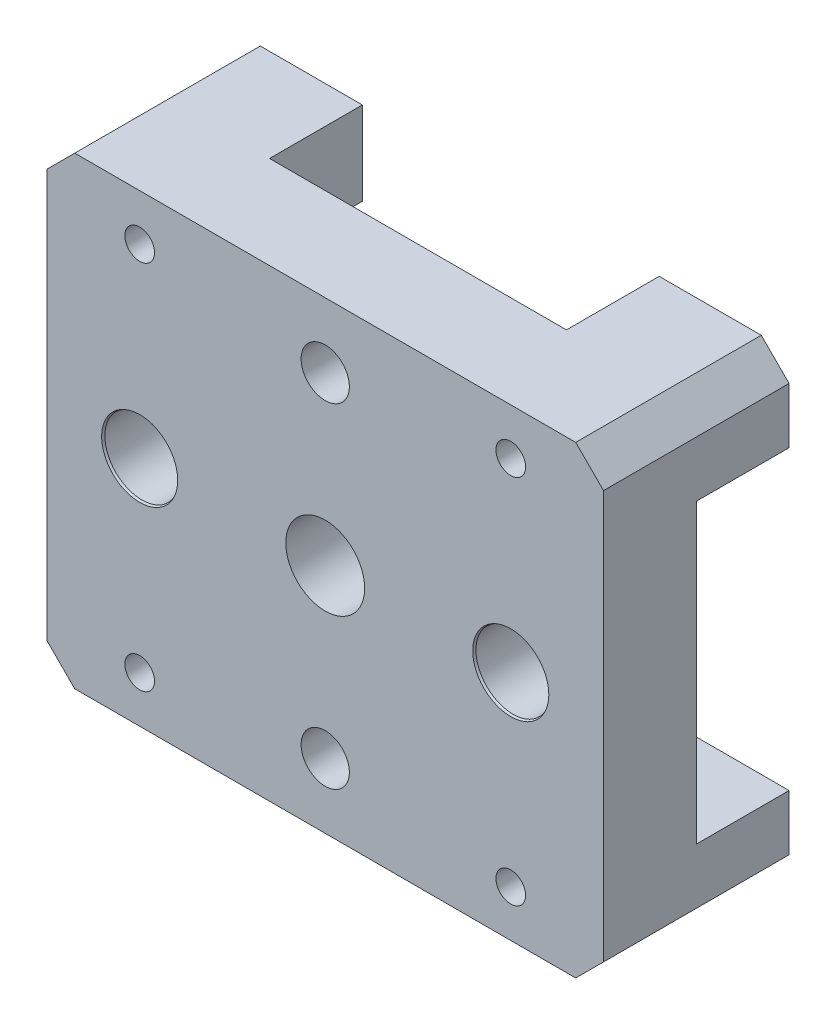
ISO-10303-21;
HEADER;
FILE_DESCRIPTION(('STEP AP214'),'2;1');
FILE_NAME('part.step','',(''),(''),'','','');
FILE_SCHEMA(('AUTOMOTIVE_DESIGN { 1 0 10303 214 1 1 1 1 }'));
ENDSEC;
DATA;
#1=APPLICATION_CONTEXT('core data for automotive mechanical design processes');
#2=APPLICATION_PROTOCOL_DEFINITION('international standard','automotive_design',2000,#1);
#3=PRODUCT_CONTEXT('',#1,'mechanical');
#4=PRODUCT('Part','Part','',(#3));
#5=PRODUCT_RELATED_PRODUCT_CATEGORY('part','',(#4));
#6=PRODUCT_DEFINITION_FORMATION('','',#4);
#7=PRODUCT_DEFINITION_CONTEXT('part definition',#1,'design');
#8=PRODUCT_DEFINITION('design','',#6,#7);
#9=PRODUCT_DEFINITION_SHAPE('','',#8);
#10=(LENGTH_UNIT() NAMED_UNIT(*) SI_UNIT(.MILLI.,.METRE.));
#11=(NAMED_UNIT(*) PLANE_ANGLE_UNIT() SI_UNIT($,.RADIAN.));
#12=(NAMED_UNIT(*) SI_UNIT($,.STERADIAN.) SOLID_ANGLE_UNIT());
#13=UNCERTAINTY_MEASURE_WITH_UNIT(LENGTH_MEASURE(1.E-05),#10,'distance_accuracy_value','');
#14=(GEOMETRIC_REPRESENTATION_CONTEXT(3) GLOBAL_UNCERTAINTY_ASSIGNED_CONTEXT((#13)) GLOBAL_UNIT_ASSIGNED_CONTEXT((#10,
#11,#12)) REPRESENTATION_CONTEXT('',''));
#15=CARTESIAN_POINT('',(0.,0.,0.));
#16=DIRECTION('',(0.,0.,1.));
#17=DIRECTION('',(1.,0.,0.));
#18=AXIS2_PLACEMENT_3D('',#15,#16,#17);
#19=CARTESIAN_POINT('',(-22.5457548907287,39.1819093878608,-11.1306806843923));
#20=DIRECTION('',(0.,0.,-1.));
#21=DIRECTION('',(-1.,0.,0.));
#22=AXIS2_PLACEMENT_3D('',#19,#20,#21);
#23=PLANE('',#22);
#24=CARTESIAN_POINT('',(-22.5457548907287,57.1819093878608,-11.1306806843923));
#25=DIRECTION('',(0.,0.,-1.));
#26=DIRECTION('',(-1.,0.,0.));
#27=AXIS2_PLACEMENT_3D('',#24,#25,#26);
#28=CIRCLE('',#27,2.60000000000001);
#29=CARTESIAN_POINT('',(-25.1457548907287,57.1819093878608,-11.1306806843923));
#30=VERTEX_POINT('',#29);
#31=EDGE_CURVE('E299',#30,#30,#28,.T.);
#32=ORIENTED_EDGE('',*,*,#31,.F.);
#33=EDGE_LOOP('',(#32));
#34=FACE_BOUND('',#33,.T.);
#35=CARTESIAN_POINT('',(-22.5457548907287,21.1819093878608,-11.1306806843923));
#36=DIRECTION('',(0.,0.,-1.));
#37=DIRECTION('',(-1.,0.,0.));
#38=AXIS2_PLACEMENT_3D('',#35,#36,#37);
#39=CIRCLE('',#38,2.60000000000001);
#40=CARTESIAN_POINT('',(-25.1457548907287,21.1819093878608,-11.1306806843923));
#41=VERTEX_POINT('',#40);
#42=EDGE_CURVE('E305',#41,#41,#39,.T.);
#43=ORIENTED_EDGE('',*,*,#42,.F.);
#44=EDGE_LOOP('',(#43));
#45=FACE_BOUND('',#44,.T.);
#46=CARTESIAN_POINT('',(-2.54575489072869,39.1819093878608,-11.1306806843923));
#47=DIRECTION('',(0.,0.,1.));
#48=DIRECTION('',(1.,0.,0.));
#49=AXIS2_PLACEMENT_3D('',#46,#47,#48);
#50=CIRCLE('',#49,4.);
#51=CARTESIAN_POINT('',(1.45424510927131,39.1819093878608,-11.1306806843923));
#52=VERTEX_POINT('',#51);
#53=EDGE_CURVE('E317',#52,#52,#50,.T.);
#54=ORIENTED_EDGE('',*,*,#53,.T.);
#55=EDGE_LOOP('',(#54));
#56=FACE_BOUND('',#55,.T.);
#57=CARTESIAN_POINT('',(-42.5457548907287,39.1819093878608,-11.1306806843923));
#58=DIRECTION('',(0.,0.,1.));
#59=DIRECTION('',(1.,0.,0.));
#60=AXIS2_PLACEMENT_3D('',#57,#58,#59);
#61=CIRCLE('',#60,4.);
#62=CARTESIAN_POINT('',(-38.5457548907287,39.1819093878608,-11.1306806843923));
#63=VERTEX_POINT('',#62);
#64=EDGE_CURVE('E326',#63,#63,#61,.T.);
#65=ORIENTED_EDGE('',*,*,#64,.T.);
#66=EDGE_LOOP('',(#65));
#67=FACE_BOUND('',#66,.T.);
#68=CARTESIAN_POINT('',(-22.5457548907287,39.1819093878608,-11.1306806843923));
#69=DIRECTION('',(0.,0.,-1.));
#70=DIRECTION('',(-1.,0.,0.));
#71=AXIS2_PLACEMENT_3D('',#68,#69,#70);
#72=CIRCLE('',#71,4.25000000000001);
#73=CARTESIAN_POINT('',(-26.7957548907287,39.1819093878608,-11.1306806843923));
#74=VERTEX_POINT('',#73);
#75=EDGE_CURVE('E332',#74,#74,#72,.T.);
#76=ORIENTED_EDGE('',*,*,#75,.F.);
#77=EDGE_LOOP('',(#76));
#78=FACE_BOUND('',#77,.T.);
#79=DIRECTION('',(-1.,0.,0.));
#80=VECTOR('',#79,1.);
#81=CARTESIAN_POINT('',(0.,23.1819093878607,-11.1306806843923));
#82=LINE('',#81,#80);
#83=CARTESIAN_POINT('',(7.45424510927131,23.1819093878607,-11.1306806843923));
#84=VERTEX_POINT('',#83);
#85=CARTESIAN_POINT('',(-6.54575489072869,23.1819093878607,-11.1306806843923));
#86=VERTEX_POINT('',#85);
#87=EDGE_CURVE('E411',#84,#86,#82,.T.);
#88=ORIENTED_EDGE('',*,*,#87,.T.);
#89=DIRECTION('',(0.,1.,0.));
#90=VECTOR('',#89,1.);
#91=CARTESIAN_POINT('',(-6.54575489072868,0.,-11.1306806843923));
#92=LINE('',#91,#90);
#93=CARTESIAN_POINT('',(-6.54575489072868,14.1819093878608,-11.1306806843923));
#94=VERTEX_POINT('',#93);
#95=EDGE_CURVE('E408',#94,#86,#92,.T.);
#96=ORIENTED_EDGE('',*,*,#95,.F.);
#97=DIRECTION('',(1.,0.,0.));
#98=VECTOR('',#97,1.);
#99=CARTESIAN_POINT('',(-52.5457548907287,14.1819093878608,-11.1306806843923));
#100=LINE('',#99,#98);
#101=CARTESIAN_POINT('',(-38.5457548907287,14.1819093878608,-11.1306806843923));
#102=VERTEX_POINT('',#101);
#103=EDGE_CURVE('E204',#102,#94,#100,.T.);
#104=ORIENTED_EDGE('',*,*,#103,.F.);
#105=DIRECTION('',(0.,1.,0.));
#106=VECTOR('',#105,1.);
#107=CARTESIAN_POINT('',(-38.5457548907287,0.,-11.1306806843923));
#108=LINE('',#107,#106);
#109=CARTESIAN_POINT('',(-38.5457548907287,23.1819093878606,-11.1306806843923));
#110=VERTEX_POINT('',#109);
#111=EDGE_CURVE('E208',#102,#110,#108,.T.);
#112=ORIENTED_EDGE('',*,*,#111,.T.);
#113=DIRECTION('',(1.,0.,0.));
#114=VECTOR('',#113,1.);
#115=CARTESIAN_POINT('',(0.,23.1819093878606,-11.1306806843923));
#116=LINE('',#115,#114);
#117=CARTESIAN_POINT('',(-52.5457548907287,23.1819093878606,-11.1306806843923));
#118=VERTEX_POINT('',#117);
#119=EDGE_CURVE('E205',#118,#110,#116,.T.);
#120=ORIENTED_EDGE('',*,*,#119,.F.);
#121=DIRECTION('',(0.,-1.,0.));
#122=VECTOR('',#121,1.);
#123=CARTESIAN_POINT('',(-52.5457548907287,14.1819093878608,-11.1306806843923));
#124=LINE('',#123,#122);
#125=CARTESIAN_POINT('',(-52.5457548907287,55.1819093878609,-11.1306806843923));
#126=VERTEX_POINT('',#125);
#127=EDGE_CURVE('E353',#126,#118,#124,.T.);
#128=ORIENTED_EDGE('',*,*,#127,.F.);
#129=DIRECTION('',(1.,0.,0.));
#130=VECTOR('',#129,1.);
#131=CARTESIAN_POINT('',(0.,55.1819093878609,-11.1306806843923));
#132=LINE('',#131,#130);
#133=CARTESIAN_POINT('',(-38.5457548907287,55.1819093878609,-11.1306806843923));
#134=VERTEX_POINT('',#133);
#135=EDGE_CURVE('E239',#126,#134,#132,.T.);
#136=ORIENTED_EDGE('',*,*,#135,.T.);
#137=DIRECTION('',(0.,-1.,0.));
#138=VECTOR('',#137,1.);
#139=CARTESIAN_POINT('',(-38.5457548907287,0.,-11.1306806843923));
#140=LINE('',#139,#138);
#141=CARTESIAN_POINT('',(-38.5457548907287,64.1819093878608,-11.1306806843923));
#142=VERTEX_POINT('',#141);
#143=EDGE_CURVE('E234',#142,#134,#140,.T.);
#144=ORIENTED_EDGE('',*,*,#143,.F.);
#145=DIRECTION('',(-1.,0.,0.));
#146=VECTOR('',#145,1.);
#147=CARTESIAN_POINT('',(-52.5457548907287,64.1819093878608,-11.1306806843923));
#148=LINE('',#147,#146);
#149=CARTESIAN_POINT('',(-6.54575489072869,64.1819093878608,-11.1306806843923));
#150=VERTEX_POINT('',#149);
#151=EDGE_CURVE('E350',#150,#142,#148,.T.);
#152=ORIENTED_EDGE('',*,*,#151,.F.);
#153=DIRECTION('',(0.,-1.,0.));
#154=VECTOR('',#153,1.);
#155=CARTESIAN_POINT('',(-6.54575489072869,0.,-11.1306806843923));
#156=LINE('',#155,#154);
#157=CARTESIAN_POINT('',(-6.5457548907287,55.181909387861,-11.1306806843923));
#158=VERTEX_POINT('',#157);
#159=EDGE_CURVE('E260',#150,#158,#156,.T.);
#160=ORIENTED_EDGE('',*,*,#159,.T.);
#161=DIRECTION('',(-1.,0.,0.));
#162=VECTOR('',#161,1.);
#163=CARTESIAN_POINT('',(0.,55.1819093878609,-11.1306806843923));
#164=LINE('',#163,#162);
#165=CARTESIAN_POINT('',(7.45424510927131,55.181909387861,-11.1306806843923));
#166=VERTEX_POINT('',#165);
#167=EDGE_CURVE('E265',#166,#158,#164,.T.);
#168=ORIENTED_EDGE('',*,*,#167,.F.);
#169=DIRECTION('',(0.,1.,0.));
#170=VECTOR('',#169,1.);
#171=CARTESIAN_POINT('',(7.45424510927131,14.1819093878608,-11.1306806843923));
#172=LINE('',#171,#170);
#173=EDGE_CURVE('E335',#84,#166,#172,.T.);
#174=ORIENTED_EDGE('',*,*,#173,.F.);
#175=EDGE_LOOP('',(#88,#96,#104,#112,#120,#128,#136,#144,#152,#160,#168,#174));
#176=FACE_BOUND('',#175,.T.);
#177=ADVANCED_FACE('F42',(#34,#45,#56,#67,#78,#176),#23,.T.);
#178=CARTESIAN_POINT('',(-22.5457548907287,39.1819093878608,-1.13068068439232));
#179=DIRECTION('',(0.,0.,-1.));
#180=DIRECTION('',(-1.,0.,0.));
#181=AXIS2_PLACEMENT_3D('',#178,#179,#180);
#182=PLANE('',#181);
#183=CARTESIAN_POINT('',(-42.5457548907287,19.1819093878606,-1.13068068439232));
#184=DIRECTION('',(0.,0.,-1.));
#185=DIRECTION('',(-1.,0.,0.));
#186=AXIS2_PLACEMENT_3D('',#183,#184,#185);
#187=CIRCLE('',#186,1.6);
#188=CARTESIAN_POINT('',(-44.1457548907287,19.1819093878606,-1.13068068439232));
#189=VERTEX_POINT('',#188);
#190=EDGE_CURVE('E292',#189,#189,#187,.T.);
#191=ORIENTED_EDGE('',*,*,#190,.T.);
#192=EDGE_LOOP('',(#191));
#193=FACE_BOUND('',#192,.T.);
#194=CARTESIAN_POINT('',(-2.54575489072869,59.181909387861,-1.13068068439232));
#195=DIRECTION('',(0.,0.,-1.));
#196=DIRECTION('',(-1.,0.,0.));
#197=AXIS2_PLACEMENT_3D('',#194,#195,#196);
#198=CIRCLE('',#197,1.59999999999999);
#199=CARTESIAN_POINT('',(-4.14575489072869,59.181909387861,-1.13068068439232));
#200=VERTEX_POINT('',#199);
#201=EDGE_CURVE('E291',#200,#200,#198,.T.);
#202=ORIENTED_EDGE('',*,*,#201,.T.);
#203=EDGE_LOOP('',(#202));
#204=FACE_BOUND('',#203,.T.);
#205=CARTESIAN_POINT('',(-22.5457548907287,57.1819093878608,-1.13068068439232));
#206=DIRECTION('',(0.,0.,-1.));
#207=DIRECTION('',(-1.,0.,0.));
#208=AXIS2_PLACEMENT_3D('',#205,#206,#207);
#209=CIRCLE('',#208,2.60000000000001);
#210=CARTESIAN_POINT('',(-25.1457548907287,57.1819093878608,-1.13068068439232));
#211=VERTEX_POINT('',#210);
#212=EDGE_CURVE('E302',#211,#211,#209,.T.);
#213=ORIENTED_EDGE('',*,*,#212,.T.);
#214=EDGE_LOOP('',(#213));
#215=FACE_BOUND('',#214,.T.);
#216=CARTESIAN_POINT('',(-22.5457548907287,21.1819093878608,-1.13068068439232));
#217=DIRECTION('',(0.,0.,-1.));
#218=DIRECTION('',(-1.,0.,0.));
#219=AXIS2_PLACEMENT_3D('',#216,#217,#218);
#220=CIRCLE('',#219,2.60000000000001);
#221=CARTESIAN_POINT('',(-25.1457548907287,21.1819093878608,-1.13068068439232));
#222=VERTEX_POINT('',#221);
#223=EDGE_CURVE('E308',#222,#222,#220,.T.);
#224=ORIENTED_EDGE('',*,*,#223,.T.);
#225=EDGE_LOOP('',(#224));
#226=FACE_BOUND('',#225,.T.);
#227=CARTESIAN_POINT('',(-2.54575489072869,39.1819093878608,-1.13068068439232));
#228=DIRECTION('',(0.,0.,1.));
#229=DIRECTION('',(1.,0.,0.));
#230=AXIS2_PLACEMENT_3D('',#227,#228,#229);
#231=CIRCLE('',#230,4.1);
#232=CARTESIAN_POINT('',(1.55424510927131,39.1819093878608,-1.13068068439232));
#233=VERTEX_POINT('',#232);
#234=EDGE_CURVE('E311',#233,#233,#231,.T.);
#235=ORIENTED_EDGE('',*,*,#234,.F.);
#236=EDGE_LOOP('',(#235));
#237=FACE_BOUND('',#236,.T.);
#238=CARTESIAN_POINT('',(-42.5457548907287,39.1819093878608,-1.13068068439232));
#239=DIRECTION('',(0.,0.,1.));
#240=DIRECTION('',(1.,0.,0.));
#241=AXIS2_PLACEMENT_3D('',#238,#239,#240);
#242=CIRCLE('',#241,4.1);
#243=CARTESIAN_POINT('',(-38.4457548907287,39.1819093878608,-1.13068068439232));
#244=VERTEX_POINT('',#243);
#245=EDGE_CURVE('E320',#244,#244,#242,.T.);
#246=ORIENTED_EDGE('',*,*,#245,.F.);
#247=EDGE_LOOP('',(#246));
#248=FACE_BOUND('',#247,.T.);
#249=CARTESIAN_POINT('',(-22.5457548907287,39.1819093878608,-1.13068068439232));
#250=DIRECTION('',(0.,0.,1.));
#251=DIRECTION('',(1.,0.,0.));
#252=AXIS2_PLACEMENT_3D('',#249,#250,#251);
#253=CIRCLE('',#252,4.25000000000002);
#254=CARTESIAN_POINT('',(-18.2957548907287,39.1819093878608,-1.13068068439232));
#255=VERTEX_POINT('',#254);
#256=EDGE_CURVE('E329',#255,#255,#253,.T.);
#257=ORIENTED_EDGE('',*,*,#256,.F.);
#258=EDGE_LOOP('',(#257));
#259=FACE_BOUND('',#258,.T.);
#260=DIRECTION('',(0.,1.,0.));
#261=VECTOR('',#260,1.);
#262=CARTESIAN_POINT('',(7.45424510927131,14.1819093878608,-1.13068068439232));
#263=LINE('',#262,#261);
#264=CARTESIAN_POINT('',(7.45424510927131,17.1819093878608,-1.13068068439232));
#265=VERTEX_POINT('',#264);
#266=CARTESIAN_POINT('',(7.45424510927131,61.1819093878608,-1.13068068439232));
#267=VERTEX_POINT('',#266);
#268=EDGE_CURVE('E336',#265,#267,#263,.T.);
#269=ORIENTED_EDGE('',*,*,#268,.T.);
#270=DIRECTION('',(0.707106781186546,-0.707106781186549,0.));
#271=VECTOR('',#270,1.);
#272=CARTESIAN_POINT('',(4.4542451092713,64.1819093878608,-1.13068068439232));
#273=LINE('',#272,#271);
#274=CARTESIAN_POINT('',(4.4542451092713,64.1819093878608,-1.13068068439232));
#275=VERTEX_POINT('',#274);
#276=EDGE_CURVE('E374',#267,#275,#273,.F.);
#277=ORIENTED_EDGE('',*,*,#276,.T.);
#278=DIRECTION('',(-1.,0.,0.));
#279=VECTOR('',#278,1.);
#280=CARTESIAN_POINT('',(-52.5457548907287,64.1819093878608,-1.13068068439232));
#281=LINE('',#280,#279);
#282=CARTESIAN_POINT('',(-49.5457548907287,64.1819093878608,-1.13068068439232));
#283=VERTEX_POINT('',#282);
#284=EDGE_CURVE('E339',#275,#283,#281,.T.);
#285=ORIENTED_EDGE('',*,*,#284,.T.);
#286=DIRECTION('',(0.707106781186548,0.707106781186547,0.));
#287=VECTOR('',#286,1.);
#288=CARTESIAN_POINT('',(-52.5457548907287,61.1819093878608,-1.13068068439232));
#289=LINE('',#288,#287);
#290=CARTESIAN_POINT('',(-52.5457548907287,61.1819093878608,-1.13068068439232));
#291=VERTEX_POINT('',#290);
#292=EDGE_CURVE('E368',#283,#291,#289,.F.);
#293=ORIENTED_EDGE('',*,*,#292,.T.);
#294=DIRECTION('',(0.,-1.,0.));
#295=VECTOR('',#294,1.);
#296=CARTESIAN_POINT('',(-52.5457548907287,14.1819093878608,-1.13068068439232));
#297=LINE('',#296,#295);
#298=CARTESIAN_POINT('',(-52.5457548907287,17.1819093878608,-1.13068068439232));
#299=VERTEX_POINT('',#298);
#300=EDGE_CURVE('E342',#291,#299,#297,.T.);
#301=ORIENTED_EDGE('',*,*,#300,.T.);
#302=DIRECTION('',(-0.707106781186546,0.707106781186549,0.));
#303=VECTOR('',#302,1.);
#304=CARTESIAN_POINT('',(-49.5457548907287,14.1819093878608,-1.13068068439232));
#305=LINE('',#304,#303);
#306=CARTESIAN_POINT('',(-49.5457548907287,14.1819093878608,-1.13068068439232));
#307=VERTEX_POINT('',#306);
#308=EDGE_CURVE('E370',#299,#307,#305,.F.);
#309=ORIENTED_EDGE('',*,*,#308,.T.);
#310=DIRECTION('',(1.,0.,0.));
#311=VECTOR('',#310,1.);
#312=CARTESIAN_POINT('',(-52.5457548907287,14.1819093878608,-1.13068068439232));
#313=LINE('',#312,#311);
#314=CARTESIAN_POINT('',(4.45424510927128,14.1819093878608,-1.13068068439232));
#315=VERTEX_POINT('',#314);
#316=EDGE_CURVE('E345',#307,#315,#313,.T.);
#317=ORIENTED_EDGE('',*,*,#316,.T.);
#318=DIRECTION('',(-0.707106781186548,-0.707106781186547,0.));
#319=VECTOR('',#318,1.);
#320=CARTESIAN_POINT('',(7.45424510927131,17.1819093878608,-1.13068068439232));
#321=LINE('',#320,#319);
#322=EDGE_CURVE('E372',#315,#265,#321,.F.);
#323=ORIENTED_EDGE('',*,*,#322,.T.);
#324=EDGE_LOOP('',(#269,#277,#285,#293,#301,#309,#317,#323));
#325=FACE_BOUND('',#324,.T.);
#326=CARTESIAN_POINT('',(-42.5457548907287,59.181909387861,-1.13068068439232));
#327=DIRECTION('',(0.,0.,1.));
#328=DIRECTION('',(1.,0.,0.));
#329=AXIS2_PLACEMENT_3D('',#326,#327,#328);
#330=CIRCLE('',#329,1.6);
#331=CARTESIAN_POINT('',(-40.9457548907287,59.181909387861,-1.13068068439232));
#332=VERTEX_POINT('',#331);
#333=EDGE_CURVE('E288',#332,#332,#330,.T.);
#334=ORIENTED_EDGE('',*,*,#333,.F.);
#335=EDGE_LOOP('',(#334));
#336=FACE_BOUND('',#335,.T.);
#337=CARTESIAN_POINT('',(-2.54575489072869,19.1819093878606,-1.13068068439232));
#338=DIRECTION('',(0.,0.,1.));
#339=DIRECTION('',(1.,0.,0.));
#340=AXIS2_PLACEMENT_3D('',#337,#338,#339);
#341=CIRCLE('',#340,1.59999999999999);
#342=CARTESIAN_POINT('',(-0.9457548907287,19.1819093878606,-1.13068068439232));
#343=VERTEX_POINT('',#342);
#344=EDGE_CURVE('E287',#343,#343,#341,.T.);
#345=ORIENTED_EDGE('',*,*,#344,.F.);
#346=EDGE_LOOP('',(#345));
#347=FACE_BOUND('',#346,.T.);
#348=ADVANCED_FACE('F392',(#193,#204,#215,#226,#237,#248,#259,#325,#336,#347),#182,.F.);
#349=CARTESIAN_POINT('',(7.45424510927131,14.1819093878608,-1.13068068439232));
#350=DIRECTION('',(-1.,0.,0.));
#351=DIRECTION('',(0.,0.,1.));
#352=AXIS2_PLACEMENT_3D('',#349,#350,#351);
#353=PLANE('',#352);
#354=DIRECTION('',(0.,-1.,0.));
#355=VECTOR('',#354,1.);
#356=CARTESIAN_POINT('',(7.45424510927131,0.,-21.1306806843923));
#357=LINE('',#356,#355);
#358=CARTESIAN_POINT('',(7.45424510927131,61.1819093878608,-21.1306806843923));
#359=VERTEX_POINT('',#358);
#360=CARTESIAN_POINT('',(7.45424510927131,55.1819093878609,-21.1306806843923));
#361=VERTEX_POINT('',#360);
#362=EDGE_CURVE('E271',#359,#361,#357,.T.);
#363=ORIENTED_EDGE('',*,*,#362,.F.);
#364=DIRECTION('',(0.,0.,1.));
#365=VECTOR('',#364,1.);
#366=CARTESIAN_POINT('',(7.45424510927131,61.1819093878608,-1.13068068439232));
#367=LINE('',#366,#365);
#368=EDGE_CURVE('E366',#359,#267,#367,.T.);
#369=ORIENTED_EDGE('',*,*,#368,.T.);
#370=ORIENTED_EDGE('',*,*,#268,.F.);
#371=DIRECTION('',(0.,0.,-1.));
#372=VECTOR('',#371,1.);
#373=CARTESIAN_POINT('',(7.45424510927131,17.1819093878608,-1.13068068439232));
#374=LINE('',#373,#372);
#375=CARTESIAN_POINT('',(7.45424510927131,17.1819093878608,-21.1306806843923));
#376=VERTEX_POINT('',#375);
#377=EDGE_CURVE('E363',#265,#376,#374,.T.);
#378=ORIENTED_EDGE('',*,*,#377,.T.);
#379=DIRECTION('',(0.,-1.,0.));
#380=VECTOR('',#379,1.);
#381=CARTESIAN_POINT('',(7.45424510927131,0.,-21.1306806843923));
#382=LINE('',#381,#380);
#383=CARTESIAN_POINT('',(7.45424510927131,23.1819093878607,-21.1306806843923));
#384=VERTEX_POINT('',#383);
#385=EDGE_CURVE('E415',#384,#376,#382,.T.);
#386=ORIENTED_EDGE('',*,*,#385,.F.);
#387=DIRECTION('',(0.,0.,1.));
#388=VECTOR('',#387,1.);
#389=CARTESIAN_POINT('',(7.45424510927131,23.1819093878607,-21.1306806843923));
#390=LINE('',#389,#388);
#391=EDGE_CURVE('E210',#384,#84,#390,.T.);
#392=ORIENTED_EDGE('',*,*,#391,.T.);
#393=ORIENTED_EDGE('',*,*,#173,.T.);
#394=DIRECTION('',(0.,0.,1.));
#395=VECTOR('',#394,1.);
#396=CARTESIAN_POINT('',(7.45424510927131,55.1819093878609,-21.1306806843923));
#397=LINE('',#396,#395);
#398=EDGE_CURVE('E281',#361,#166,#397,.T.);
#399=ORIENTED_EDGE('',*,*,#398,.F.);
#400=EDGE_LOOP('',(#363,#369,#370,#378,#386,#392,#393,#399));
#401=FACE_BOUND('',#400,.T.);
#402=ADVANCED_FACE('F448',(#401),#353,.F.);
#403=CARTESIAN_POINT('',(-52.5457548907287,64.1819093878608,-1.13068068439232));
#404=DIRECTION('',(0.,-1.,0.));
#405=DIRECTION('',(0.,0.,-1.));
#406=AXIS2_PLACEMENT_3D('',#403,#404,#405);
#407=PLANE('',#406);
#408=ORIENTED_EDGE('',*,*,#284,.F.);
#409=DIRECTION('',(0.,0.,-1.));
#410=VECTOR('',#409,1.);
#411=CARTESIAN_POINT('',(4.4542451092713,64.1819093878608,-1.13068068439232));
#412=LINE('',#411,#410);
#413=CARTESIAN_POINT('',(4.4542451092713,64.1819093878608,-21.1306806843923));
#414=VERTEX_POINT('',#413);
#415=EDGE_CURVE('E358',#275,#414,#412,.T.);
#416=ORIENTED_EDGE('',*,*,#415,.T.);
#417=DIRECTION('',(1.,0.,0.));
#418=VECTOR('',#417,1.);
#419=CARTESIAN_POINT('',(0.,64.1819093878608,-21.1306806843923));
#420=LINE('',#419,#418);
#421=CARTESIAN_POINT('',(-6.54575489072869,64.1819093878608,-21.1306806843923));
#422=VERTEX_POINT('',#421);
#423=EDGE_CURVE('E268',#422,#414,#420,.T.);
#424=ORIENTED_EDGE('',*,*,#423,.F.);
#425=DIRECTION('',(0.,0.,1.));
#426=VECTOR('',#425,1.);
#427=CARTESIAN_POINT('',(-6.54575489072869,64.1819093878608,-21.1306806843923));
#428=LINE('',#427,#426);
#429=EDGE_CURVE('E284',#422,#150,#428,.T.);
#430=ORIENTED_EDGE('',*,*,#429,.T.);
#431=ORIENTED_EDGE('',*,*,#151,.T.);
#432=DIRECTION('',(0.,0.,1.));
#433=VECTOR('',#432,1.);
#434=CARTESIAN_POINT('',(-38.5457548907287,64.1819093878608,-21.1306806843923));
#435=LINE('',#434,#433);
#436=CARTESIAN_POINT('',(-38.5457548907287,64.1819093878608,-21.1306806843923));
#437=VERTEX_POINT('',#436);
#438=EDGE_CURVE('E258',#437,#142,#435,.T.);
#439=ORIENTED_EDGE('',*,*,#438,.F.);
#440=DIRECTION('',(1.,0.,0.));
#441=VECTOR('',#440,1.);
#442=CARTESIAN_POINT('',(0.,64.1819093878608,-21.1306806843923));
#443=LINE('',#442,#441);
#444=CARTESIAN_POINT('',(-49.5457548907287,64.1819093878608,-21.1306806843923));
#445=VERTEX_POINT('',#444);
#446=EDGE_CURVE('E238',#445,#437,#443,.T.);
#447=ORIENTED_EDGE('',*,*,#446,.F.);
#448=DIRECTION('',(0.,0.,1.));
#449=VECTOR('',#448,1.);
#450=CARTESIAN_POINT('',(-49.5457548907287,64.1819093878608,-1.13068068439232));
#451=LINE('',#450,#449);
#452=EDGE_CURVE('E348',#445,#283,#451,.T.);
#453=ORIENTED_EDGE('',*,*,#452,.T.);
#454=EDGE_LOOP('',(#408,#416,#424,#430,#431,#439,#447,#453));
#455=FACE_BOUND('',#454,.T.);
#456=ADVANCED_FACE('F460',(#455),#407,.F.);
#457=CARTESIAN_POINT('',(-52.5457548907287,14.1819093878608,-1.13068068439232));
#458=DIRECTION('',(1.,0.,0.));
#459=DIRECTION('',(0.,0.,-1.));
#460=AXIS2_PLACEMENT_3D('',#457,#458,#459);
#461=PLANE('',#460);
#462=DIRECTION('',(0.,1.,0.));
#463=VECTOR('',#462,1.);
#464=CARTESIAN_POINT('',(-52.5457548907287,0.,-21.1306806843923));
#465=LINE('',#464,#463);
#466=CARTESIAN_POINT('',(-52.5457548907287,17.1819093878608,-21.1306806843923));
#467=VERTEX_POINT('',#466);
#468=CARTESIAN_POINT('',(-52.5457548907287,23.1819093878606,-21.1306806843923));
#469=VERTEX_POINT('',#468);
#470=EDGE_CURVE('E217',#467,#469,#465,.T.);
#471=ORIENTED_EDGE('',*,*,#470,.F.);
#472=DIRECTION('',(0.,0.,1.));
#473=VECTOR('',#472,1.);
#474=CARTESIAN_POINT('',(-52.5457548907287,17.1819093878608,-1.13068068439232));
#475=LINE('',#474,#473);
#476=EDGE_CURVE('E51',#467,#299,#475,.T.);
#477=ORIENTED_EDGE('',*,*,#476,.T.);
#478=ORIENTED_EDGE('',*,*,#300,.F.);
#479=DIRECTION('',(0.,0.,-1.));
#480=VECTOR('',#479,1.);
#481=CARTESIAN_POINT('',(-52.5457548907287,61.1819093878608,-1.13068068439232));
#482=LINE('',#481,#480);
#483=CARTESIAN_POINT('',(-52.5457548907287,61.1819093878608,-21.1306806843923));
#484=VERTEX_POINT('',#483);
#485=EDGE_CURVE('E383',#291,#484,#482,.T.);
#486=ORIENTED_EDGE('',*,*,#485,.T.);
#487=DIRECTION('',(0.,1.,0.));
#488=VECTOR('',#487,1.);
#489=CARTESIAN_POINT('',(-52.5457548907287,0.,-21.1306806843923));
#490=LINE('',#489,#488);
#491=CARTESIAN_POINT('',(-52.5457548907287,55.1819093878609,-21.1306806843923));
#492=VERTEX_POINT('',#491);
#493=EDGE_CURVE('E246',#492,#484,#490,.T.);
#494=ORIENTED_EDGE('',*,*,#493,.F.);
#495=DIRECTION('',(0.,0.,1.));
#496=VECTOR('',#495,1.);
#497=CARTESIAN_POINT('',(-52.5457548907287,55.1819093878609,-21.1306806843923));
#498=LINE('',#497,#496);
#499=EDGE_CURVE('E249',#492,#126,#498,.T.);
#500=ORIENTED_EDGE('',*,*,#499,.T.);
#501=ORIENTED_EDGE('',*,*,#127,.T.);
#502=DIRECTION('',(0.,0.,1.));
#503=VECTOR('',#502,1.);
#504=CARTESIAN_POINT('',(-52.5457548907287,23.1819093878606,-21.1306806843923));
#505=LINE('',#504,#503);
#506=EDGE_CURVE('E232',#469,#118,#505,.T.);
#507=ORIENTED_EDGE('',*,*,#506,.F.);
#508=EDGE_LOOP('',(#471,#477,#478,#486,#494,#500,#501,#507));
#509=FACE_BOUND('',#508,.T.);
#510=ADVANCED_FACE('F387',(#509),#461,.F.);
#511=CARTESIAN_POINT('',(-52.5457548907287,14.1819093878608,-1.13068068439232));
#512=DIRECTION('',(0.,1.,0.));
#513=DIRECTION('',(0.,0.,1.));
#514=AXIS2_PLACEMENT_3D('',#511,#512,#513);
#515=PLANE('',#514);
#516=DIRECTION('',(-1.,0.,0.));
#517=VECTOR('',#516,1.);
#518=CARTESIAN_POINT('',(0.,14.1819093878608,-21.1306806843923));
#519=LINE('',#518,#517);
#520=CARTESIAN_POINT('',(4.45424510927128,14.1819093878608,-21.1306806843923));
#521=VERTEX_POINT('',#520);
#522=CARTESIAN_POINT('',(-6.54575489072868,14.1819093878608,-21.1306806843923));
#523=VERTEX_POINT('',#522);
#524=EDGE_CURVE('E178',#521,#523,#519,.T.);
#525=ORIENTED_EDGE('',*,*,#524,.F.);
#526=DIRECTION('',(0.,0.,1.));
#527=VECTOR('',#526,1.);
#528=CARTESIAN_POINT('',(4.45424510927128,14.1819093878608,-1.13068068439232));
#529=LINE('',#528,#527);
#530=EDGE_CURVE('E380',#521,#315,#529,.T.);
#531=ORIENTED_EDGE('',*,*,#530,.T.);
#532=ORIENTED_EDGE('',*,*,#316,.F.);
#533=DIRECTION('',(0.,0.,-1.));
#534=VECTOR('',#533,1.);
#535=CARTESIAN_POINT('',(-49.5457548907287,14.1819093878608,-1.13068068439232));
#536=LINE('',#535,#534);
#537=CARTESIAN_POINT('',(-49.5457548907287,14.1819093878608,-21.1306806843923));
#538=VERTEX_POINT('',#537);
#539=EDGE_CURVE('E377',#307,#538,#536,.T.);
#540=ORIENTED_EDGE('',*,*,#539,.T.);
#541=DIRECTION('',(-1.,0.,0.));
#542=VECTOR('',#541,1.);
#543=CARTESIAN_POINT('',(0.,14.1819093878608,-21.1306806843923));
#544=LINE('',#543,#542);
#545=CARTESIAN_POINT('',(-38.5457548907287,14.1819093878608,-21.1306806843923));
#546=VERTEX_POINT('',#545);
#547=EDGE_CURVE('E224',#546,#538,#544,.T.);
#548=ORIENTED_EDGE('',*,*,#547,.F.);
#549=DIRECTION('',(0.,0.,1.));
#550=VECTOR('',#549,1.);
#551=CARTESIAN_POINT('',(-38.5457548907287,14.1819093878608,-21.1306806843923));
#552=LINE('',#551,#550);
#553=EDGE_CURVE('E225',#546,#102,#552,.T.);
#554=ORIENTED_EDGE('',*,*,#553,.T.);
#555=ORIENTED_EDGE('',*,*,#103,.T.);
#556=DIRECTION('',(0.,0.,1.));
#557=VECTOR('',#556,1.);
#558=CARTESIAN_POINT('',(-6.54575489072868,14.1819093878608,-21.1306806843923));
#559=LINE('',#558,#557);
#560=EDGE_CURVE('E194',#523,#94,#559,.T.);
#561=ORIENTED_EDGE('',*,*,#560,.F.);
#562=EDGE_LOOP('',(#525,#531,#532,#540,#548,#554,#555,#561));
#563=FACE_BOUND('',#562,.T.);
#564=ADVANCED_FACE('F201',(#563),#515,.F.);
#565=CARTESIAN_POINT('',(-22.5457548907287,39.1819093878608,-1.13068068439232));
#566=DIRECTION('',(0.,0.,1.));
#567=DIRECTION('',(1.,0.,0.));
#568=AXIS2_PLACEMENT_3D('',#565,#566,#567);
#569=CYLINDRICAL_SURFACE('',#568,4.25000000000001);
#570=ORIENTED_EDGE('',*,*,#75,.T.);
#571=EDGE_LOOP('',(#570));
#572=FACE_BOUND('',#571,.T.);
#573=ORIENTED_EDGE('',*,*,#256,.T.);
#574=EDGE_LOOP('',(#573));
#575=FACE_BOUND('',#574,.T.);
#576=ADVANCED_FACE('F457',(#572,#575),#569,.F.);
#577=CARTESIAN_POINT('',(-42.5457548907287,39.1819093878608,-1.13068068439232));
#578=DIRECTION('',(0.,0.,1.));
#579=DIRECTION('',(1.,0.,0.));
#580=AXIS2_PLACEMENT_3D('',#577,#578,#579);
#581=CYLINDRICAL_SURFACE('',#580,4.00000000000001);
#582=ORIENTED_EDGE('',*,*,#64,.F.);
#583=EDGE_LOOP('',(#582));
#584=FACE_BOUND('',#583,.T.);
#585=CARTESIAN_POINT('',(-42.5457548907287,39.1819093878608,-1.37210204062959));
#586=DIRECTION('',(0.,0.,1.));
#587=DIRECTION('',(1.,0.,0.));
#588=AXIS2_PLACEMENT_3D('',#585,#586,#587);
#589=CIRCLE('',#588,4.00000000000001);
#590=CARTESIAN_POINT('',(-38.5457548907287,39.1819093878608,-1.37210204062959));
#591=VERTEX_POINT('',#590);
#592=EDGE_CURVE('E323',#591,#591,#589,.T.);
#593=ORIENTED_EDGE('',*,*,#592,.T.);
#594=EDGE_LOOP('',(#593));
#595=FACE_BOUND('',#594,.T.);
#596=ADVANCED_FACE('F561',(#584,#595),#581,.F.);
#597=CARTESIAN_POINT('',(-42.5457548907287,39.1819093878608,-1.13068068439232));
#598=DIRECTION('',(0.,0.,1.));
#599=DIRECTION('',(1.,0.,0.));
#600=AXIS2_PLACEMENT_3D('',#597,#598,#599);
#601=CONICAL_SURFACE('',#600,4.1,0.392699081698732);
#602=ORIENTED_EDGE('',*,*,#592,.F.);
#603=EDGE_LOOP('',(#602));
#604=FACE_BOUND('',#603,.T.);
#605=ORIENTED_EDGE('',*,*,#245,.T.);
#606=EDGE_LOOP('',(#605));
#607=FACE_BOUND('',#606,.T.);
#608=ADVANCED_FACE('F557',(#604,#607),#601,.F.);
#609=CARTESIAN_POINT('',(-2.54575489072869,39.1819093878608,-1.13068068439232));
#610=DIRECTION('',(0.,0.,1.));
#611=DIRECTION('',(1.,0.,0.));
#612=AXIS2_PLACEMENT_3D('',#609,#610,#611);
#613=CYLINDRICAL_SURFACE('',#612,4.00000000000001);
#614=ORIENTED_EDGE('',*,*,#53,.F.);
#615=EDGE_LOOP('',(#614));
#616=FACE_BOUND('',#615,.T.);
#617=CARTESIAN_POINT('',(-2.54575489072869,39.1819093878608,-1.37210204062959));
#618=DIRECTION('',(0.,0.,1.));
#619=DIRECTION('',(1.,0.,0.));
#620=AXIS2_PLACEMENT_3D('',#617,#618,#619);
#621=CIRCLE('',#620,4.00000000000001);
#622=CARTESIAN_POINT('',(1.45424510927133,39.1819093878608,-1.37210204062959));
#623=VERTEX_POINT('',#622);
#624=EDGE_CURVE('E314',#623,#623,#621,.T.);
#625=ORIENTED_EDGE('',*,*,#624,.T.);
#626=EDGE_LOOP('',(#625));
#627=FACE_BOUND('',#626,.T.);
#628=ADVANCED_FACE('F553',(#616,#627),#613,.F.);
#629=CARTESIAN_POINT('',(-2.54575489072869,39.1819093878608,-1.13068068439232));
#630=DIRECTION('',(0.,0.,1.));
#631=DIRECTION('',(1.,0.,0.));
#632=AXIS2_PLACEMENT_3D('',#629,#630,#631);
#633=CONICAL_SURFACE('',#632,4.1,0.392699081698732);
#634=ORIENTED_EDGE('',*,*,#624,.F.);
#635=EDGE_LOOP('',(#634));
#636=FACE_BOUND('',#635,.T.);
#637=ORIENTED_EDGE('',*,*,#234,.T.);
#638=EDGE_LOOP('',(#637));
#639=FACE_BOUND('',#638,.T.);
#640=ADVANCED_FACE('F549',(#636,#639),#633,.F.);
#641=CARTESIAN_POINT('',(-22.5457548907287,21.1819093878608,-11.1306806843923));
#642=DIRECTION('',(0.,0.,-1.));
#643=DIRECTION('',(-1.,0.,0.));
#644=AXIS2_PLACEMENT_3D('',#641,#642,#643);
#645=CYLINDRICAL_SURFACE('',#644,2.60000000000001);
#646=ORIENTED_EDGE('',*,*,#223,.F.);
#647=EDGE_LOOP('',(#646));
#648=FACE_BOUND('',#647,.T.);
#649=ORIENTED_EDGE('',*,*,#42,.T.);
#650=EDGE_LOOP('',(#649));
#651=FACE_BOUND('',#650,.T.);
#652=ADVANCED_FACE('F541',(#648,#651),#645,.F.);
#653=CARTESIAN_POINT('',(-22.5457548907287,57.1819093878608,-11.1306806843923));
#654=DIRECTION('',(0.,0.,-1.));
#655=DIRECTION('',(-1.,0.,0.));
#656=AXIS2_PLACEMENT_3D('',#653,#654,#655);
#657=CYLINDRICAL_SURFACE('',#656,2.60000000000001);
#658=ORIENTED_EDGE('',*,*,#212,.F.);
#659=EDGE_LOOP('',(#658));
#660=FACE_BOUND('',#659,.T.);
#661=ORIENTED_EDGE('',*,*,#31,.T.);
#662=EDGE_LOOP('',(#661));
#663=FACE_BOUND('',#662,.T.);
#664=ADVANCED_FACE('F531',(#660,#663),#657,.F.);
#665=CARTESIAN_POINT('',(-2.54575489072869,59.181909387861,-1.13068068439232));
#666=DIRECTION('',(0.,0.,-1.));
#667=DIRECTION('',(-1.,0.,0.));
#668=AXIS2_PLACEMENT_3D('',#665,#666,#667);
#669=CYLINDRICAL_SURFACE('',#668,1.59999999999999);
#670=ORIENTED_EDGE('',*,*,#201,.F.);
#671=EDGE_LOOP('',(#670));
#672=FACE_BOUND('',#671,.T.);
#673=CARTESIAN_POINT('',(-2.54575489072869,59.181909387861,-21.1306806843923));
#674=DIRECTION('',(0.,0.,-1.));
#675=DIRECTION('',(-1.,0.,0.));
#676=AXIS2_PLACEMENT_3D('',#673,#674,#675);
#677=CIRCLE('',#676,1.59999999999999);
#678=CARTESIAN_POINT('',(-4.14575489072869,59.181909387861,-21.1306806843923));
#679=VERTEX_POINT('',#678);
#680=EDGE_CURVE('E261',#679,#679,#677,.F.);
#681=ORIENTED_EDGE('',*,*,#680,.F.);
#682=EDGE_LOOP('',(#681));
#683=FACE_BOUND('',#682,.T.);
#684=ADVANCED_FACE('F526',(#672,#683),#669,.F.);
#685=CARTESIAN_POINT('',(-42.5457548907287,59.181909387861,-1.13068068439232));
#686=DIRECTION('',(0.,0.,-1.));
#687=DIRECTION('',(-1.,0.,0.));
#688=AXIS2_PLACEMENT_3D('',#685,#686,#687);
#689=CYLINDRICAL_SURFACE('',#688,1.6);
#690=ORIENTED_EDGE('',*,*,#333,.T.);
#691=EDGE_LOOP('',(#690));
#692=FACE_BOUND('',#691,.T.);
#693=CARTESIAN_POINT('',(-42.5457548907287,59.181909387861,-21.1306806843923));
#694=DIRECTION('',(0.,0.,-1.));
#695=DIRECTION('',(-1.,0.,0.));
#696=AXIS2_PLACEMENT_3D('',#693,#694,#695);
#697=CIRCLE('',#696,1.6);
#698=CARTESIAN_POINT('',(-44.1457548907287,59.181909387861,-21.1306806843923));
#699=VERTEX_POINT('',#698);
#700=EDGE_CURVE('E235',#699,#699,#697,.F.);
#701=ORIENTED_EDGE('',*,*,#700,.F.);
#702=EDGE_LOOP('',(#701));
#703=FACE_BOUND('',#702,.T.);
#704=ADVANCED_FACE('F438',(#692,#703),#689,.F.);
#705=CARTESIAN_POINT('',(-42.5457548907287,19.1819093878606,-1.13068068439232));
#706=DIRECTION('',(0.,0.,-1.));
#707=DIRECTION('',(-1.,0.,0.));
#708=AXIS2_PLACEMENT_3D('',#705,#706,#707);
#709=CYLINDRICAL_SURFACE('',#708,1.6);
#710=ORIENTED_EDGE('',*,*,#190,.F.);
#711=EDGE_LOOP('',(#710));
#712=FACE_BOUND('',#711,.T.);
#713=CARTESIAN_POINT('',(-42.5457548907287,19.1819093878606,-21.1306806843923));
#714=DIRECTION('',(0.,0.,-1.));
#715=DIRECTION('',(-1.,0.,0.));
#716=AXIS2_PLACEMENT_3D('',#713,#714,#715);
#717=CIRCLE('',#716,1.6);
#718=CARTESIAN_POINT('',(-44.1457548907287,19.1819093878606,-21.1306806843923));
#719=VERTEX_POINT('',#718);
#720=EDGE_CURVE('E214',#719,#719,#717,.F.);
#721=ORIENTED_EDGE('',*,*,#720,.F.);
#722=EDGE_LOOP('',(#721));
#723=FACE_BOUND('',#722,.T.);
#724=ADVANCED_FACE('F428',(#712,#723),#709,.F.);
#725=CARTESIAN_POINT('',(-2.54575489072869,19.1819093878606,-1.13068068439232));
#726=DIRECTION('',(0.,0.,-1.));
#727=DIRECTION('',(-1.,0.,0.));
#728=AXIS2_PLACEMENT_3D('',#725,#726,#727);
#729=CYLINDRICAL_SURFACE('',#728,1.59999999999999);
#730=ORIENTED_EDGE('',*,*,#344,.T.);
#731=EDGE_LOOP('',(#730));
#732=FACE_BOUND('',#731,.T.);
#733=CARTESIAN_POINT('',(-2.54575489072869,19.1819093878606,-21.1306806843923));
#734=DIRECTION('',(0.,0.,-1.));
#735=DIRECTION('',(-1.,0.,0.));
#736=AXIS2_PLACEMENT_3D('',#733,#734,#735);
#737=CIRCLE('',#736,1.59999999999999);
#738=CARTESIAN_POINT('',(-4.14575489072868,19.1819093878606,-21.1306806843923));
#739=VERTEX_POINT('',#738);
#740=EDGE_CURVE('E189',#739,#739,#737,.F.);
#741=ORIENTED_EDGE('',*,*,#740,.F.);
#742=EDGE_LOOP('',(#741));
#743=FACE_BOUND('',#742,.T.);
#744=ADVANCED_FACE('F425',(#732,#743),#729,.F.);
#745=CARTESIAN_POINT('',(-6.54575489072869,0.,-21.1306806843923));
#746=DIRECTION('',(-1.,0.,0.));
#747=DIRECTION('',(0.,0.,1.));
#748=AXIS2_PLACEMENT_3D('',#745,#746,#747);
#749=PLANE('',#748);
#750=ORIENTED_EDGE('',*,*,#159,.F.);
#751=ORIENTED_EDGE('',*,*,#429,.F.);
#752=DIRECTION('',(0.,-1.,0.));
#753=VECTOR('',#752,1.);
#754=CARTESIAN_POINT('',(-6.54575489072869,0.,-21.1306806843923));
#755=LINE('',#754,#753);
#756=CARTESIAN_POINT('',(-6.5457548907287,55.181909387861,-21.1306806843923));
#757=VERTEX_POINT('',#756);
#758=EDGE_CURVE('E264',#422,#757,#755,.T.);
#759=ORIENTED_EDGE('',*,*,#758,.T.);
#760=DIRECTION('',(0.,0.,1.));
#761=VECTOR('',#760,1.);
#762=CARTESIAN_POINT('',(-6.5457548907287,55.181909387861,-21.1306806843923));
#763=LINE('',#762,#761);
#764=EDGE_CURVE('E275',#757,#158,#763,.T.);
#765=ORIENTED_EDGE('',*,*,#764,.T.);
#766=EDGE_LOOP('',(#750,#751,#759,#765));
#767=FACE_BOUND('',#766,.T.);
#768=ADVANCED_FACE('F427',(#767),#749,.T.);
#769=CARTESIAN_POINT('',(0.,55.1819093878609,-21.1306806843923));
#770=DIRECTION('',(0.,1.,0.));
#771=DIRECTION('',(0.,0.,1.));
#772=AXIS2_PLACEMENT_3D('',#769,#770,#771);
#773=PLANE('',#772);
#774=ORIENTED_EDGE('',*,*,#167,.T.);
#775=ORIENTED_EDGE('',*,*,#764,.F.);
#776=DIRECTION('',(-1.,0.,0.));
#777=VECTOR('',#776,1.);
#778=CARTESIAN_POINT('',(0.,55.1819093878609,-21.1306806843923));
#779=LINE('',#778,#777);
#780=EDGE_CURVE('E273',#361,#757,#779,.T.);
#781=ORIENTED_EDGE('',*,*,#780,.F.);
#782=ORIENTED_EDGE('',*,*,#398,.T.);
#783=EDGE_LOOP('',(#774,#775,#781,#782));
#784=FACE_BOUND('',#783,.T.);
#785=ADVANCED_FACE('F435',(#784),#773,.F.);
#786=CARTESIAN_POINT('',(0.,0.,-21.1306806843923));
#787=DIRECTION('',(0.,0.,-1.));
#788=DIRECTION('',(-1.,0.,0.));
#789=AXIS2_PLACEMENT_3D('',#786,#787,#788);
#790=PLANE('',#789);
#791=ORIENTED_EDGE('',*,*,#680,.T.);
#792=EDGE_LOOP('',(#791));
#793=FACE_BOUND('',#792,.T.);
#794=ORIENTED_EDGE('',*,*,#423,.T.);
#795=DIRECTION('',(-0.707106781186546,0.707106781186549,0.));
#796=VECTOR('',#795,1.);
#797=CARTESIAN_POINT('',(34.3180772485661,34.3180772485659,-21.1306806843923));
#798=LINE('',#797,#796);
#799=EDGE_CURVE('E361',#414,#359,#798,.F.);
#800=ORIENTED_EDGE('',*,*,#799,.T.);
#801=ORIENTED_EDGE('',*,*,#362,.T.);
#802=ORIENTED_EDGE('',*,*,#780,.T.);
#803=ORIENTED_EDGE('',*,*,#758,.F.);
#804=EDGE_LOOP('',(#794,#800,#801,#802,#803));
#805=FACE_BOUND('',#804,.T.);
#806=ADVANCED_FACE('F517',(#793,#805),#790,.T.);
#807=CARTESIAN_POINT('',(-38.5457548907287,0.,-21.1306806843923));
#808=DIRECTION('',(-1.,0.,0.));
#809=DIRECTION('',(0.,-1.,0.));
#810=AXIS2_PLACEMENT_3D('',#807,#808,#809);
#811=PLANE('',#810);
#812=ORIENTED_EDGE('',*,*,#143,.T.);
#813=DIRECTION('',(0.,0.,1.));
#814=VECTOR('',#813,1.);
#815=CARTESIAN_POINT('',(-38.5457548907287,55.1819093878609,-21.1306806843923));
#816=LINE('',#815,#814);
#817=CARTESIAN_POINT('',(-38.5457548907287,55.1819093878609,-21.1306806843923));
#818=VERTEX_POINT('',#817);
#819=EDGE_CURVE('E256',#818,#134,#816,.T.);
#820=ORIENTED_EDGE('',*,*,#819,.F.);
#821=DIRECTION('',(0.,-1.,0.));
#822=VECTOR('',#821,1.);
#823=CARTESIAN_POINT('',(-38.5457548907287,0.,-21.1306806843923));
#824=LINE('',#823,#822);
#825=EDGE_CURVE('E241',#437,#818,#824,.T.);
#826=ORIENTED_EDGE('',*,*,#825,.F.);
#827=ORIENTED_EDGE('',*,*,#438,.T.);
#828=EDGE_LOOP('',(#812,#820,#826,#827));
#829=FACE_BOUND('',#828,.T.);
#830=ADVANCED_FACE('F514',(#829),#811,.F.);
#831=CARTESIAN_POINT('',(0.,55.1819093878609,-21.1306806843923));
#832=DIRECTION('',(0.,-1.,0.));
#833=DIRECTION('',(0.,0.,-1.));
#834=AXIS2_PLACEMENT_3D('',#831,#832,#833);
#835=PLANE('',#834);
#836=ORIENTED_EDGE('',*,*,#135,.F.);
#837=ORIENTED_EDGE('',*,*,#499,.F.);
#838=DIRECTION('',(1.,0.,0.));
#839=VECTOR('',#838,1.);
#840=CARTESIAN_POINT('',(0.,55.1819093878609,-21.1306806843923));
#841=LINE('',#840,#839);
#842=EDGE_CURVE('E243',#492,#818,#841,.T.);
#843=ORIENTED_EDGE('',*,*,#842,.T.);
#844=ORIENTED_EDGE('',*,*,#819,.T.);
#845=EDGE_LOOP('',(#836,#837,#843,#844));
#846=FACE_BOUND('',#845,.T.);
#847=ADVANCED_FACE('F496',(#846),#835,.T.);
#848=CARTESIAN_POINT('',(0.,0.,-21.1306806843923));
#849=DIRECTION('',(0.,0.,-1.));
#850=DIRECTION('',(-1.,0.,0.));
#851=AXIS2_PLACEMENT_3D('',#848,#849,#850);
#852=PLANE('',#851);
#853=ORIENTED_EDGE('',*,*,#700,.T.);
#854=EDGE_LOOP('',(#853));
#855=FACE_BOUND('',#854,.T.);
#856=ORIENTED_EDGE('',*,*,#493,.T.);
#857=DIRECTION('',(-0.707106781186548,-0.707106781186547,0.));
#858=VECTOR('',#857,1.);
#859=CARTESIAN_POINT('',(-56.8638321392947,56.8638321392948,-21.1306806843923));
#860=LINE('',#859,#858);
#861=EDGE_CURVE('E11',#484,#445,#860,.F.);
#862=ORIENTED_EDGE('',*,*,#861,.T.);
#863=ORIENTED_EDGE('',*,*,#446,.T.);
#864=ORIENTED_EDGE('',*,*,#825,.T.);
#865=ORIENTED_EDGE('',*,*,#842,.F.);
#866=EDGE_LOOP('',(#856,#862,#863,#864,#865));
#867=FACE_BOUND('',#866,.T.);
#868=ADVANCED_FACE('F491',(#855,#867),#852,.T.);
#869=CARTESIAN_POINT('',(0.,23.1819093878606,-21.1306806843923));
#870=DIRECTION('',(0.,-1.,0.));
#871=DIRECTION('',(0.,0.,-1.));
#872=AXIS2_PLACEMENT_3D('',#869,#870,#871);
#873=PLANE('',#872);
#874=ORIENTED_EDGE('',*,*,#119,.T.);
#875=DIRECTION('',(0.,0.,1.));
#876=VECTOR('',#875,1.);
#877=CARTESIAN_POINT('',(-38.5457548907287,23.1819093878606,-21.1306806843923));
#878=LINE('',#877,#876);
#879=CARTESIAN_POINT('',(-38.5457548907287,23.1819093878606,-21.1306806843923));
#880=VERTEX_POINT('',#879);
#881=EDGE_CURVE('E230',#880,#110,#878,.T.);
#882=ORIENTED_EDGE('',*,*,#881,.F.);
#883=DIRECTION('',(1.,0.,0.));
#884=VECTOR('',#883,1.);
#885=CARTESIAN_POINT('',(0.,23.1819093878606,-21.1306806843923));
#886=LINE('',#885,#884);
#887=EDGE_CURVE('E219',#469,#880,#886,.T.);
#888=ORIENTED_EDGE('',*,*,#887,.F.);
#889=ORIENTED_EDGE('',*,*,#506,.T.);
#890=EDGE_LOOP('',(#874,#882,#888,#889));
#891=FACE_BOUND('',#890,.T.);
#892=ADVANCED_FACE('F500',(#891),#873,.F.);
#893=CARTESIAN_POINT('',(-38.5457548907287,0.,-21.1306806843923));
#894=DIRECTION('',(1.,0.,0.));
#895=DIRECTION('',(0.,1.,0.));
#896=AXIS2_PLACEMENT_3D('',#893,#894,#895);
#897=PLANE('',#896);
#898=ORIENTED_EDGE('',*,*,#111,.F.);
#899=ORIENTED_EDGE('',*,*,#553,.F.);
#900=DIRECTION('',(0.,1.,0.));
#901=VECTOR('',#900,1.);
#902=CARTESIAN_POINT('',(-38.5457548907287,0.,-21.1306806843923));
#903=LINE('',#902,#901);
#904=EDGE_CURVE('E221',#546,#880,#903,.T.);
#905=ORIENTED_EDGE('',*,*,#904,.T.);
#906=ORIENTED_EDGE('',*,*,#881,.T.);
#907=EDGE_LOOP('',(#898,#899,#905,#906));
#908=FACE_BOUND('',#907,.T.);
#909=ADVANCED_FACE('F404',(#908),#897,.T.);
#910=CARTESIAN_POINT('',(0.,0.,-21.1306806843923));
#911=DIRECTION('',(0.,0.,-1.));
#912=DIRECTION('',(-1.,0.,0.));
#913=AXIS2_PLACEMENT_3D('',#910,#911,#912);
#914=PLANE('',#913);
#915=ORIENTED_EDGE('',*,*,#720,.T.);
#916=EDGE_LOOP('',(#915));
#917=FACE_BOUND('',#916,.T.);
#918=ORIENTED_EDGE('',*,*,#547,.T.);
#919=DIRECTION('',(0.707106781186546,-0.707106781186549,0.));
#920=VECTOR('',#919,1.);
#921=CARTESIAN_POINT('',(-17.6819227514341,-17.681922751434,-21.1306806843923));
#922=LINE('',#921,#920);
#923=EDGE_CURVE('E64',#538,#467,#922,.F.);
#924=ORIENTED_EDGE('',*,*,#923,.T.);
#925=ORIENTED_EDGE('',*,*,#470,.T.);
#926=ORIENTED_EDGE('',*,*,#887,.T.);
#927=ORIENTED_EDGE('',*,*,#904,.F.);
#928=EDGE_LOOP('',(#918,#924,#925,#926,#927));
#929=FACE_BOUND('',#928,.T.);
#930=ADVANCED_FACE('F400',(#917,#929),#914,.T.);
#931=CARTESIAN_POINT('',(-6.54575489072868,0.,-21.1306806843923));
#932=DIRECTION('',(1.,0.,0.));
#933=DIRECTION('',(0.,1.,0.));
#934=AXIS2_PLACEMENT_3D('',#931,#932,#933);
#935=PLANE('',#934);
#936=ORIENTED_EDGE('',*,*,#95,.T.);
#937=DIRECTION('',(0.,0.,1.));
#938=VECTOR('',#937,1.);
#939=CARTESIAN_POINT('',(-6.54575489072869,23.1819093878607,-21.1306806843923));
#940=LINE('',#939,#938);
#941=CARTESIAN_POINT('',(-6.54575489072869,23.1819093878607,-21.1306806843923));
#942=VERTEX_POINT('',#941);
#943=EDGE_CURVE('E196',#942,#86,#940,.T.);
#944=ORIENTED_EDGE('',*,*,#943,.F.);
#945=DIRECTION('',(0.,1.,0.));
#946=VECTOR('',#945,1.);
#947=CARTESIAN_POINT('',(-6.54575489072868,0.,-21.1306806843923));
#948=LINE('',#947,#946);
#949=EDGE_CURVE('E183',#523,#942,#948,.T.);
#950=ORIENTED_EDGE('',*,*,#949,.F.);
#951=ORIENTED_EDGE('',*,*,#560,.T.);
#952=EDGE_LOOP('',(#936,#944,#950,#951));
#953=FACE_BOUND('',#952,.T.);
#954=ADVANCED_FACE('F193',(#953),#935,.F.);
#955=CARTESIAN_POINT('',(0.,23.1819093878607,-21.1306806843923));
#956=DIRECTION('',(0.,1.,0.));
#957=DIRECTION('',(0.,0.,1.));
#958=AXIS2_PLACEMENT_3D('',#955,#956,#957);
#959=PLANE('',#958);
#960=ORIENTED_EDGE('',*,*,#87,.F.);
#961=ORIENTED_EDGE('',*,*,#391,.F.);
#962=DIRECTION('',(-1.,0.,0.));
#963=VECTOR('',#962,1.);
#964=CARTESIAN_POINT('',(0.,23.1819093878607,-21.1306806843923));
#965=LINE('',#964,#963);
#966=EDGE_CURVE('E198',#384,#942,#965,.T.);
#967=ORIENTED_EDGE('',*,*,#966,.T.);
#968=ORIENTED_EDGE('',*,*,#943,.T.);
#969=EDGE_LOOP('',(#960,#961,#967,#968));
#970=FACE_BOUND('',#969,.T.);
#971=ADVANCED_FACE('F676',(#970),#959,.T.);
#972=CARTESIAN_POINT('',(0.,0.,-21.1306806843923));
#973=DIRECTION('',(0.,0.,-1.));
#974=DIRECTION('',(-1.,0.,0.));
#975=AXIS2_PLACEMENT_3D('',#972,#973,#974);
#976=PLANE('',#975);
#977=ORIENTED_EDGE('',*,*,#740,.T.);
#978=EDGE_LOOP('',(#977));
#979=FACE_BOUND('',#978,.T.);
#980=ORIENTED_EDGE('',*,*,#385,.T.);
#981=DIRECTION('',(0.707106781186548,0.707106781186547,0.));
#982=VECTOR('',#981,1.);
#983=CARTESIAN_POINT('',(-4.86383213929476,4.86383213929477,-21.1306806843923));
#984=LINE('',#983,#982);
#985=EDGE_CURVE('E185',#376,#521,#984,.F.);
#986=ORIENTED_EDGE('',*,*,#985,.T.);
#987=ORIENTED_EDGE('',*,*,#524,.T.);
#988=ORIENTED_EDGE('',*,*,#949,.T.);
#989=ORIENTED_EDGE('',*,*,#966,.F.);
#990=EDGE_LOOP('',(#980,#986,#987,#988,#989));
#991=FACE_BOUND('',#990,.T.);
#992=ADVANCED_FACE('F181',(#979,#991),#976,.T.);
#993=CARTESIAN_POINT('',(4.4542451092713,64.1819093878608,-1.13068068439232));
#994=DIRECTION('',(-0.707106781186549,-0.707106781186546,0.));
#995=DIRECTION('',(0.,0.,-1.));
#996=AXIS2_PLACEMENT_3D('',#993,#994,#995);
#997=PLANE('',#996);
#998=ORIENTED_EDGE('',*,*,#276,.F.);
#999=ORIENTED_EDGE('',*,*,#368,.F.);
#1000=ORIENTED_EDGE('',*,*,#799,.F.);
#1001=ORIENTED_EDGE('',*,*,#415,.F.);
#1002=EDGE_LOOP('',(#998,#999,#1000,#1001));
#1003=FACE_BOUND('',#1002,.T.);
#1004=ADVANCED_FACE('F467',(#1003),#997,.F.);
#1005=CARTESIAN_POINT('',(7.45424510927131,17.1819093878608,-1.13068068439232));
#1006=DIRECTION('',(-0.707106781186547,0.707106781186548,0.));
#1007=DIRECTION('',(0.,0.,-1.));
#1008=AXIS2_PLACEMENT_3D('',#1005,#1006,#1007);
#1009=PLANE('',#1008);
#1010=ORIENTED_EDGE('',*,*,#322,.F.);
#1011=ORIENTED_EDGE('',*,*,#530,.F.);
#1012=ORIENTED_EDGE('',*,*,#985,.F.);
#1013=ORIENTED_EDGE('',*,*,#377,.F.);
#1014=EDGE_LOOP('',(#1010,#1011,#1012,#1013));
#1015=FACE_BOUND('',#1014,.T.);
#1016=ADVANCED_FACE('F473',(#1015),#1009,.F.);
#1017=CARTESIAN_POINT('',(-49.5457548907287,14.1819093878608,-1.13068068439232));
#1018=DIRECTION('',(0.707106781186549,0.707106781186546,0.));
#1019=DIRECTION('',(0.,0.,-1.));
#1020=AXIS2_PLACEMENT_3D('',#1017,#1018,#1019);
#1021=PLANE('',#1020);
#1022=ORIENTED_EDGE('',*,*,#308,.F.);
#1023=ORIENTED_EDGE('',*,*,#476,.F.);
#1024=ORIENTED_EDGE('',*,*,#923,.F.);
#1025=ORIENTED_EDGE('',*,*,#539,.F.);
#1026=EDGE_LOOP('',(#1022,#1023,#1024,#1025));
#1027=FACE_BOUND('',#1026,.T.);
#1028=ADVANCED_FACE('F397',(#1027),#1021,.F.);
#1029=CARTESIAN_POINT('',(-52.5457548907287,61.1819093878608,-1.13068068439232));
#1030=DIRECTION('',(0.707106781186547,-0.707106781186548,0.));
#1031=DIRECTION('',(0.,0.,-1.));
#1032=AXIS2_PLACEMENT_3D('',#1029,#1030,#1031);
#1033=PLANE('',#1032);
#1034=ORIENTED_EDGE('',*,*,#292,.F.);
#1035=ORIENTED_EDGE('',*,*,#452,.F.);
#1036=ORIENTED_EDGE('',*,*,#861,.F.);
#1037=ORIENTED_EDGE('',*,*,#485,.F.);
#1038=EDGE_LOOP('',(#1034,#1035,#1036,#1037));
#1039=FACE_BOUND('',#1038,.T.);
#1040=ADVANCED_FACE('F45',(#1039),#1033,.F.);
#1041=CLOSED_SHELL('',(#177,#348,#402,#456,#510,#564,#576,#596,#608,#628,#640,#652,#664,#684,
#704,#724,#744,#768,#785,#806,#830,#847,#868,#892,#909,#930,#954,#971,#992,#1004,#1016,#1028,#1040));
#1042=MANIFOLD_SOLID_BREP('B2',#1041);
#1043=ADVANCED_BREP_SHAPE_REPRESENTATION('',(#18,#1042),#14);
#1044=SHAPE_DEFINITION_REPRESENTATION(#9,#1043);
ENDSEC;
END-ISO-10303-21;
